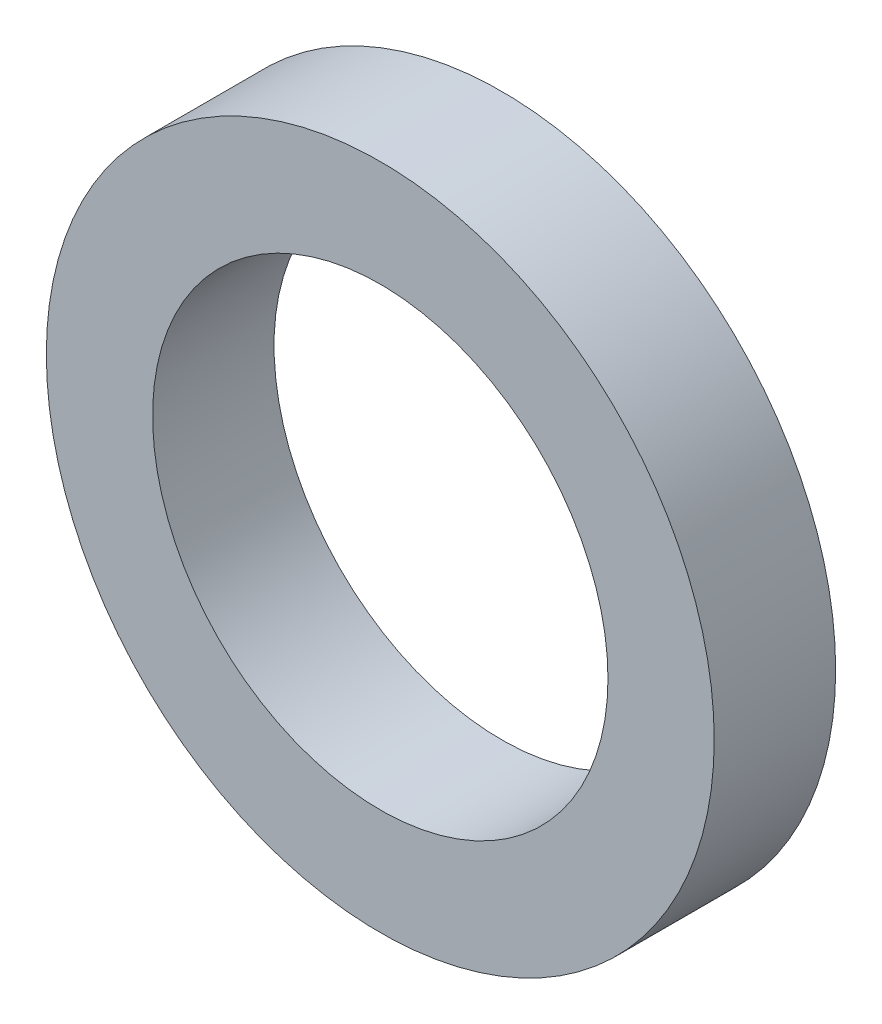
ISO-10303-21;
HEADER;
FILE_DESCRIPTION(('STEP AP214'),'2;1');
FILE_NAME('part.step','',(''),(''),'','','');
FILE_SCHEMA(('AUTOMOTIVE_DESIGN { 1 0 10303 214 1 1 1 1 }'));
ENDSEC;
DATA;
#1=APPLICATION_CONTEXT('core data for automotive mechanical design processes');
#2=APPLICATION_PROTOCOL_DEFINITION('international standard','automotive_design',2000,#1);
#3=PRODUCT_CONTEXT('',#1,'mechanical');
#4=PRODUCT('Part','Part','',(#3));
#5=PRODUCT_RELATED_PRODUCT_CATEGORY('part','',(#4));
#6=PRODUCT_DEFINITION_FORMATION('','',#4);
#7=PRODUCT_DEFINITION_CONTEXT('part definition',#1,'design');
#8=PRODUCT_DEFINITION('design','',#6,#7);
#9=PRODUCT_DEFINITION_SHAPE('','',#8);
#10=(LENGTH_UNIT() NAMED_UNIT(*) SI_UNIT(.MILLI.,.METRE.));
#11=(NAMED_UNIT(*) PLANE_ANGLE_UNIT() SI_UNIT($,.RADIAN.));
#12=(NAMED_UNIT(*) SI_UNIT($,.STERADIAN.) SOLID_ANGLE_UNIT());
#13=UNCERTAINTY_MEASURE_WITH_UNIT(LENGTH_MEASURE(1.E-05),#10,'distance_accuracy_value','');
#14=(GEOMETRIC_REPRESENTATION_CONTEXT(3) GLOBAL_UNCERTAINTY_ASSIGNED_CONTEXT((#13)) GLOBAL_UNIT_ASSIGNED_CONTEXT((#10,
#11,#12)) REPRESENTATION_CONTEXT('',''));
#15=CARTESIAN_POINT('',(0.,0.,0.));
#16=DIRECTION('',(0.,0.,1.));
#17=DIRECTION('',(1.,0.,0.));
#18=AXIS2_PLACEMENT_3D('',#15,#16,#17);
#19=CARTESIAN_POINT('',(0.,0.,-2.));
#20=DIRECTION('',(0.,0.,1.));
#21=DIRECTION('',(1.,0.,0.));
#22=AXIS2_PLACEMENT_3D('',#19,#20,#21);
#23=CYLINDRICAL_SURFACE('',#22,5.5);
#24=CARTESIAN_POINT('',(0.,0.,-2.));
#25=DIRECTION('',(0.,0.,1.));
#26=DIRECTION('',(1.,0.,0.));
#27=AXIS2_PLACEMENT_3D('',#24,#25,#26);
#28=CIRCLE('',#27,5.5);
#29=CARTESIAN_POINT('',(5.5,0.,-2.));
#30=VERTEX_POINT('',#29);
#31=EDGE_CURVE('E10',#30,#30,#28,.T.);
#32=ORIENTED_EDGE('',*,*,#31,.T.);
#33=EDGE_LOOP('',(#32));
#34=FACE_BOUND('',#33,.T.);
#35=CARTESIAN_POINT('',(0.,0.,0.));
#36=DIRECTION('',(0.,0.,1.));
#37=DIRECTION('',(1.,0.,0.));
#38=AXIS2_PLACEMENT_3D('',#35,#36,#37);
#39=CIRCLE('',#38,5.5);
#40=CARTESIAN_POINT('',(5.5,0.,0.));
#41=VERTEX_POINT('',#40);
#42=EDGE_CURVE('E33',#41,#41,#39,.T.);
#43=ORIENTED_EDGE('',*,*,#42,.F.);
#44=EDGE_LOOP('',(#43));
#45=FACE_BOUND('',#44,.T.);
#46=ADVANCED_FACE('F30',(#34,#45),#23,.T.);
#47=CARTESIAN_POINT('',(0.,0.,-2.));
#48=DIRECTION('',(0.,0.,1.));
#49=DIRECTION('',(1.,0.,0.));
#50=AXIS2_PLACEMENT_3D('',#47,#48,#49);
#51=PLANE('',#50);
#52=CARTESIAN_POINT('',(0.,0.,-2.));
#53=DIRECTION('',(0.,0.,1.));
#54=DIRECTION('',(1.,0.,0.));
#55=AXIS2_PLACEMENT_3D('',#52,#53,#54);
#56=CIRCLE('',#55,3.75);
#57=CARTESIAN_POINT('',(3.75,0.,-2.));
#58=VERTEX_POINT('',#57);
#59=EDGE_CURVE('E40',#58,#58,#56,.T.);
#60=ORIENTED_EDGE('',*,*,#59,.T.);
#61=EDGE_LOOP('',(#60));
#62=FACE_BOUND('',#61,.T.);
#63=ORIENTED_EDGE('',*,*,#31,.F.);
#64=EDGE_LOOP('',(#63));
#65=FACE_BOUND('',#64,.T.);
#66=ADVANCED_FACE('F48',(#62,#65),#51,.F.);
#67=CARTESIAN_POINT('',(0.,0.,0.));
#68=DIRECTION('',(0.,0.,1.));
#69=DIRECTION('',(1.,0.,0.));
#70=AXIS2_PLACEMENT_3D('',#67,#68,#69);
#71=PLANE('',#70);
#72=CARTESIAN_POINT('',(0.,0.,0.));
#73=DIRECTION('',(0.,0.,1.));
#74=DIRECTION('',(1.,0.,0.));
#75=AXIS2_PLACEMENT_3D('',#72,#73,#74);
#76=CIRCLE('',#75,3.75);
#77=CARTESIAN_POINT('',(3.75,0.,0.));
#78=VERTEX_POINT('',#77);
#79=EDGE_CURVE('E42',#78,#78,#76,.T.);
#80=ORIENTED_EDGE('',*,*,#79,.F.);
#81=EDGE_LOOP('',(#80));
#82=FACE_BOUND('',#81,.T.);
#83=ORIENTED_EDGE('',*,*,#42,.T.);
#84=EDGE_LOOP('',(#83));
#85=FACE_BOUND('',#84,.T.);
#86=ADVANCED_FACE('F54',(#82,#85),#71,.T.);
#87=CARTESIAN_POINT('',(0.,0.,-2.));
#88=DIRECTION('',(0.,0.,1.));
#89=DIRECTION('',(1.,0.,0.));
#90=AXIS2_PLACEMENT_3D('',#87,#88,#89);
#91=CYLINDRICAL_SURFACE('',#90,3.75);
#92=ORIENTED_EDGE('',*,*,#59,.F.);
#93=EDGE_LOOP('',(#92));
#94=FACE_BOUND('',#93,.T.);
#95=ORIENTED_EDGE('',*,*,#79,.T.);
#96=EDGE_LOOP('',(#95));
#97=FACE_BOUND('',#96,.T.);
#98=ADVANCED_FACE('F51',(#94,#97),#91,.F.);
#99=CLOSED_SHELL('',(#46,#66,#86,#98));
#100=MANIFOLD_SOLID_BREP('B2',#99);
#101=ADVANCED_BREP_SHAPE_REPRESENTATION('',(#18,#100),#14);
#102=SHAPE_DEFINITION_REPRESENTATION(#9,#101);
ENDSEC;
END-ISO-10303-21;
